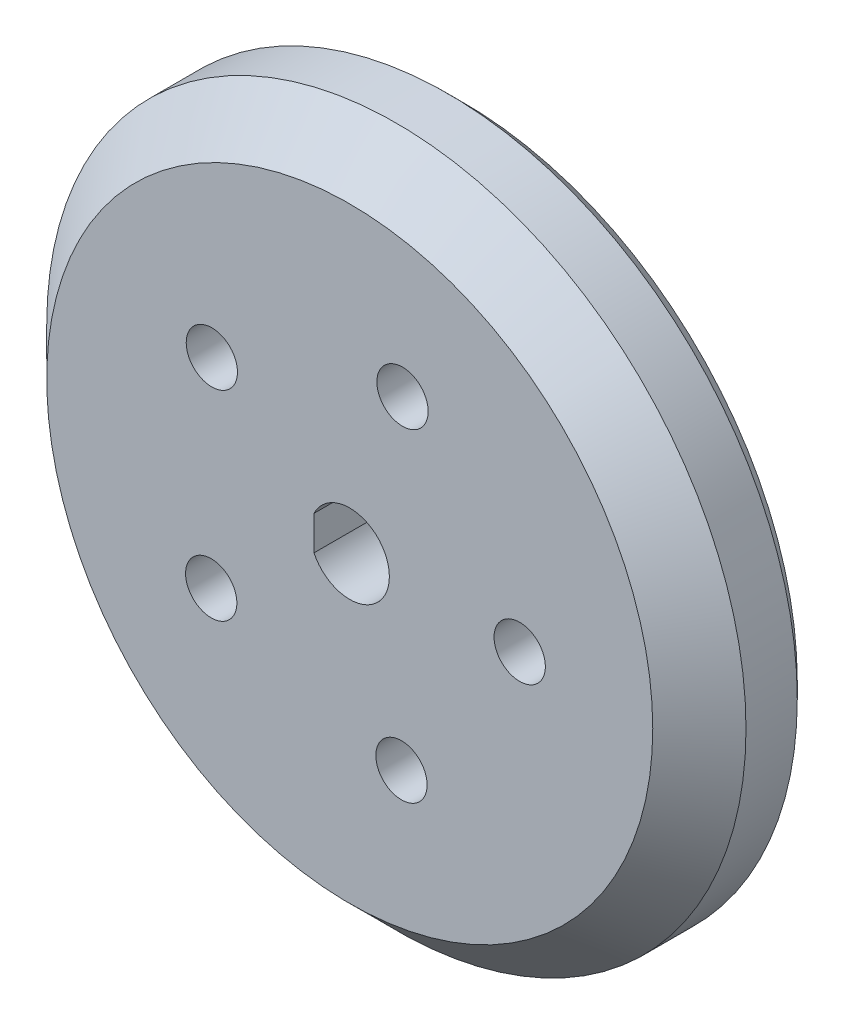
ISO-10303-21;
HEADER;
FILE_DESCRIPTION(('STEP AP214'),'2;1');
FILE_NAME('part.step','',(''),(''),'','','');
FILE_SCHEMA(('AUTOMOTIVE_DESIGN { 1 0 10303 214 1 1 1 1 }'));
ENDSEC;
DATA;
#1=APPLICATION_CONTEXT('core data for automotive mechanical design processes');
#2=APPLICATION_PROTOCOL_DEFINITION('international standard','automotive_design',2000,#1);
#3=PRODUCT_CONTEXT('',#1,'mechanical');
#4=PRODUCT('Part','Part','',(#3));
#5=PRODUCT_RELATED_PRODUCT_CATEGORY('part','',(#4));
#6=PRODUCT_DEFINITION_FORMATION('','',#4);
#7=PRODUCT_DEFINITION_CONTEXT('part definition',#1,'design');
#8=PRODUCT_DEFINITION('design','',#6,#7);
#9=PRODUCT_DEFINITION_SHAPE('','',#8);
#10=(LENGTH_UNIT() NAMED_UNIT(*) SI_UNIT(.MILLI.,.METRE.));
#11=(NAMED_UNIT(*) PLANE_ANGLE_UNIT() SI_UNIT($,.RADIAN.));
#12=(NAMED_UNIT(*) SI_UNIT($,.STERADIAN.) SOLID_ANGLE_UNIT());
#13=UNCERTAINTY_MEASURE_WITH_UNIT(LENGTH_MEASURE(1.E-05),#10,'distance_accuracy_value','');
#14=(GEOMETRIC_REPRESENTATION_CONTEXT(3) GLOBAL_UNCERTAINTY_ASSIGNED_CONTEXT((#13)) GLOBAL_UNIT_ASSIGNED_CONTEXT((#10,
#11,#12)) REPRESENTATION_CONTEXT('',''));
#15=CARTESIAN_POINT('',(0.,0.,0.));
#16=DIRECTION('',(0.,0.,1.));
#17=DIRECTION('',(1.,0.,0.));
#18=AXIS2_PLACEMENT_3D('',#15,#16,#17);
#19=CARTESIAN_POINT('',(0.,0.,7.3));
#20=DIRECTION('',(0.,0.,-1.));
#21=DIRECTION('',(-1.,0.,0.));
#22=AXIS2_PLACEMENT_3D('',#19,#20,#21);
#23=CYLINDRICAL_SURFACE('',#22,2.55);
#24=DIRECTION('',(0.,0.,1.));
#25=VECTOR('',#24,1.);
#26=CARTESIAN_POINT('',(-2.3,-1.10113577727726,-0.216416025930151));
#27=LINE('',#26,#25);
#28=CARTESIAN_POINT('',(-2.3,-1.10113577727726,2.));
#29=VERTEX_POINT('',#28);
#30=CARTESIAN_POINT('',(-2.3,-1.10113577727726,7.3));
#31=VERTEX_POINT('',#30);
#32=EDGE_CURVE('E55',#29,#31,#27,.T.);
#33=ORIENTED_EDGE('',*,*,#32,.T.);
#34=CARTESIAN_POINT('',(0.,0.,7.3));
#35=DIRECTION('',(0.,0.,1.));
#36=DIRECTION('',(1.,0.,0.));
#37=AXIS2_PLACEMENT_3D('',#34,#35,#36);
#38=CIRCLE('',#37,2.55);
#39=CARTESIAN_POINT('',(-2.3,1.10113577727726,7.3));
#40=VERTEX_POINT('',#39);
#41=EDGE_CURVE('E59',#31,#40,#38,.T.);
#42=ORIENTED_EDGE('',*,*,#41,.T.);
#43=DIRECTION('',(0.,0.,1.));
#44=VECTOR('',#43,1.);
#45=CARTESIAN_POINT('',(-2.3,1.10113577727726,-0.216416025930151));
#46=LINE('',#45,#44);
#47=CARTESIAN_POINT('',(-2.3,1.10113577727726,2.));
#48=VERTEX_POINT('',#47);
#49=EDGE_CURVE('E85',#48,#40,#46,.T.);
#50=ORIENTED_EDGE('',*,*,#49,.F.);
#51=CARTESIAN_POINT('',(0.,0.,2.));
#52=DIRECTION('',(0.,0.,-1.));
#53=DIRECTION('',(-1.,0.,0.));
#54=AXIS2_PLACEMENT_3D('',#51,#52,#53);
#55=CIRCLE('',#54,2.55);
#56=EDGE_CURVE('E43',#48,#29,#55,.T.);
#57=ORIENTED_EDGE('',*,*,#56,.T.);
#58=EDGE_LOOP('',(#33,#42,#50,#57));
#59=FACE_BOUND('',#58,.T.);
#60=ADVANCED_FACE('F39',(#59),#23,.F.);
#61=CARTESIAN_POINT('',(0.,0.,7.3));
#62=DIRECTION('',(0.,0.,1.));
#63=DIRECTION('',(1.,0.,0.));
#64=AXIS2_PLACEMENT_3D('',#61,#62,#63);
#65=PLANE('',#64);
#66=CARTESIAN_POINT('',(0.,0.,7.3));
#67=DIRECTION('',(0.,0.,1.));
#68=DIRECTION('',(1.,0.,0.));
#69=AXIS2_PLACEMENT_3D('',#66,#67,#68);
#70=CIRCLE('',#69,19.5);
#71=CARTESIAN_POINT('',(19.5,0.,7.3));
#72=VERTEX_POINT('',#71);
#73=EDGE_CURVE('E48',#72,#72,#70,.T.);
#74=ORIENTED_EDGE('',*,*,#73,.T.);
#75=EDGE_LOOP('',(#74));
#76=FACE_BOUND('',#75,.T.);
#77=CARTESIAN_POINT('',(3.32987337597584,-10.4021806469781,7.3));
#78=DIRECTION('',(0.,0.,-1.));
#79=DIRECTION('',(-1.,0.,0.));
#80=AXIS2_PLACEMENT_3D('',#77,#78,#79);
#81=CIRCLE('',#80,1.65);
#82=CARTESIAN_POINT('',(1.67987337597584,-10.4021806469781,7.3));
#83=VERTEX_POINT('',#82);
#84=EDGE_CURVE('E83',#83,#83,#81,.T.);
#85=ORIENTED_EDGE('',*,*,#84,.T.);
#86=EDGE_LOOP('',(#85));
#87=FACE_BOUND('',#86,.T.);
#88=CARTESIAN_POINT('',(-8.91407422569483,-6.38134837113389,7.3));
#89=DIRECTION('',(0.,0.,-1.));
#90=DIRECTION('',(-1.,0.,0.));
#91=AXIS2_PLACEMENT_3D('',#88,#89,#90);
#92=CIRCLE('',#91,1.65);
#93=CARTESIAN_POINT('',(-10.5640742256948,-6.38134837113389,7.3));
#94=VERTEX_POINT('',#93);
#95=EDGE_CURVE('E121',#94,#94,#92,.T.);
#96=ORIENTED_EDGE('',*,*,#95,.T.);
#97=EDGE_LOOP('',(#96));
#98=FACE_BOUND('',#97,.T.);
#99=CARTESIAN_POINT('',(-8.8736233759759,6.50584328537859,7.3));
#100=DIRECTION('',(0.,0.,-1.));
#101=DIRECTION('',(-1.,0.,0.));
#102=AXIS2_PLACEMENT_3D('',#99,#100,#101);
#103=CIRCLE('',#102,1.65);
#104=CARTESIAN_POINT('',(-10.5236233759759,6.50584328537859,7.3));
#105=VERTEX_POINT('',#104);
#106=EDGE_CURVE('E118',#105,#105,#103,.T.);
#107=ORIENTED_EDGE('',*,*,#106,.T.);
#108=EDGE_LOOP('',(#107));
#109=FACE_BOUND('',#108,.T.);
#110=CARTESIAN_POINT('',(3.39532422569488,10.4497334727931,7.3));
#111=DIRECTION('',(0.,0.,-1.));
#112=DIRECTION('',(-1.,0.,0.));
#113=AXIS2_PLACEMENT_3D('',#110,#111,#112);
#114=CIRCLE('',#113,1.65);
#115=CARTESIAN_POINT('',(1.74532422569488,10.4497334727931,7.3));
#116=VERTEX_POINT('',#115);
#117=EDGE_CURVE('E115',#116,#116,#114,.T.);
#118=ORIENTED_EDGE('',*,*,#117,.T.);
#119=EDGE_LOOP('',(#118));
#120=FACE_BOUND('',#119,.T.);
#121=CARTESIAN_POINT('',(10.9375,0.,7.3));
#122=DIRECTION('',(0.,0.,-1.));
#123=DIRECTION('',(-1.,0.,0.));
#124=AXIS2_PLACEMENT_3D('',#121,#122,#123);
#125=CIRCLE('',#124,1.65);
#126=CARTESIAN_POINT('',(9.2875,0.,7.3));
#127=VERTEX_POINT('',#126);
#128=EDGE_CURVE('E111',#127,#127,#125,.T.);
#129=ORIENTED_EDGE('',*,*,#128,.T.);
#130=EDGE_LOOP('',(#129));
#131=FACE_BOUND('',#130,.T.);
#132=ORIENTED_EDGE('',*,*,#41,.F.);
#133=DIRECTION('',(0.,1.,0.));
#134=VECTOR('',#133,1.);
#135=CARTESIAN_POINT('',(-2.3,-1.10113577727726,7.3));
#136=LINE('',#135,#134);
#137=EDGE_CURVE('E91',#31,#40,#136,.T.);
#138=ORIENTED_EDGE('',*,*,#137,.T.);
#139=EDGE_LOOP('',(#132,#138));
#140=FACE_BOUND('',#139,.T.);
#141=ADVANCED_FACE('F180',(#76,#87,#98,#109,#120,#131,#140),#65,.T.);
#142=CARTESIAN_POINT('',(0.,0.,0.));
#143=DIRECTION('',(0.,0.,1.));
#144=DIRECTION('',(1.,0.,0.));
#145=AXIS2_PLACEMENT_3D('',#142,#143,#144);
#146=PLANE('',#145);
#147=DIRECTION('',(0.,-1.,0.));
#148=VECTOR('',#147,1.);
#149=CARTESIAN_POINT('',(5.65,-6.54980915752513,0.));
#150=LINE('',#149,#148);
#151=CARTESIAN_POINT('',(5.65,6.54980915752513,0.));
#152=VERTEX_POINT('',#151);
#153=CARTESIAN_POINT('',(5.65,-6.54980915752513,0.));
#154=VERTEX_POINT('',#153);
#155=EDGE_CURVE('E101',#152,#154,#150,.T.);
#156=ORIENTED_EDGE('',*,*,#155,.F.);
#157=CARTESIAN_POINT('',(0.,0.,0.));
#158=DIRECTION('',(0.,0.,-1.));
#159=DIRECTION('',(-1.,0.,0.));
#160=AXIS2_PLACEMENT_3D('',#157,#158,#159);
#161=CIRCLE('',#160,8.65);
#162=EDGE_CURVE('E96',#154,#152,#161,.T.);
#163=ORIENTED_EDGE('',*,*,#162,.F.);
#164=EDGE_LOOP('',(#156,#163));
#165=FACE_BOUND('',#164,.T.);
#166=CARTESIAN_POINT('',(0.,0.,0.));
#167=DIRECTION('',(0.,0.,1.));
#168=DIRECTION('',(1.,0.,0.));
#169=AXIS2_PLACEMENT_3D('',#166,#167,#168);
#170=CIRCLE('',#169,21.5);
#171=CARTESIAN_POINT('',(21.5,0.,0.));
#172=VERTEX_POINT('',#171);
#173=EDGE_CURVE('E174',#172,#172,#170,.F.);
#174=ORIENTED_EDGE('',*,*,#173,.T.);
#175=EDGE_LOOP('',(#174));
#176=FACE_BOUND('',#175,.T.);
#177=CARTESIAN_POINT('',(3.32987337597584,-10.4021806469781,0.));
#178=DIRECTION('',(0.,0.,1.));
#179=DIRECTION('',(1.,0.,0.));
#180=AXIS2_PLACEMENT_3D('',#177,#178,#179);
#181=CIRCLE('',#180,1.65);
#182=CARTESIAN_POINT('',(4.97987337597584,-10.4021806469781,0.));
#183=VERTEX_POINT('',#182);
#184=EDGE_CURVE('E156',#183,#183,#181,.T.);
#185=ORIENTED_EDGE('',*,*,#184,.T.);
#186=EDGE_LOOP('',(#185));
#187=FACE_BOUND('',#186,.T.);
#188=CARTESIAN_POINT('',(-8.91407422569483,-6.38134837113389,0.));
#189=DIRECTION('',(0.,0.,1.));
#190=DIRECTION('',(1.,0.,0.));
#191=AXIS2_PLACEMENT_3D('',#188,#189,#190);
#192=CIRCLE('',#191,1.65);
#193=CARTESIAN_POINT('',(-7.26407422569483,-6.38134837113389,0.));
#194=VERTEX_POINT('',#193);
#195=EDGE_CURVE('E167',#194,#194,#192,.T.);
#196=ORIENTED_EDGE('',*,*,#195,.T.);
#197=EDGE_LOOP('',(#196));
#198=FACE_BOUND('',#197,.T.);
#199=CARTESIAN_POINT('',(-8.8736233759759,6.50584328537859,0.));
#200=DIRECTION('',(0.,0.,1.));
#201=DIRECTION('',(1.,0.,0.));
#202=AXIS2_PLACEMENT_3D('',#199,#200,#201);
#203=CIRCLE('',#202,1.65);
#204=CARTESIAN_POINT('',(-7.2236233759759,6.50584328537859,0.));
#205=VERTEX_POINT('',#204);
#206=EDGE_CURVE('E164',#205,#205,#203,.T.);
#207=ORIENTED_EDGE('',*,*,#206,.T.);
#208=EDGE_LOOP('',(#207));
#209=FACE_BOUND('',#208,.T.);
#210=CARTESIAN_POINT('',(3.39532422569488,10.4497334727931,0.));
#211=DIRECTION('',(0.,0.,1.));
#212=DIRECTION('',(1.,0.,0.));
#213=AXIS2_PLACEMENT_3D('',#210,#211,#212);
#214=CIRCLE('',#213,1.65);
#215=CARTESIAN_POINT('',(5.04532422569488,10.4497334727931,0.));
#216=VERTEX_POINT('',#215);
#217=EDGE_CURVE('E161',#216,#216,#214,.T.);
#218=ORIENTED_EDGE('',*,*,#217,.T.);
#219=EDGE_LOOP('',(#218));
#220=FACE_BOUND('',#219,.T.);
#221=CARTESIAN_POINT('',(10.9375,0.,0.));
#222=DIRECTION('',(0.,0.,1.));
#223=DIRECTION('',(1.,0.,0.));
#224=AXIS2_PLACEMENT_3D('',#221,#222,#223);
#225=CIRCLE('',#224,1.65);
#226=CARTESIAN_POINT('',(12.5875,0.,0.));
#227=VERTEX_POINT('',#226);
#228=EDGE_CURVE('E114',#227,#227,#225,.T.);
#229=ORIENTED_EDGE('',*,*,#228,.T.);
#230=EDGE_LOOP('',(#229));
#231=FACE_BOUND('',#230,.T.);
#232=CARTESIAN_POINT('',(18.85,0.,0.));
#233=DIRECTION('',(0.,0.,-1.));
#234=DIRECTION('',(-1.,0.,0.));
#235=AXIS2_PLACEMENT_3D('',#232,#233,#234);
#236=CIRCLE('',#235,1.525);
#237=CARTESIAN_POINT('',(17.325,0.,0.));
#238=VERTEX_POINT('',#237);
#239=EDGE_CURVE('E129',#238,#238,#236,.T.);
#240=ORIENTED_EDGE('',*,*,#239,.F.);
#241=EDGE_LOOP('',(#240));
#242=FACE_BOUND('',#241,.T.);
#243=CARTESIAN_POINT('',(5.82497034396776,17.9274153321637,0.));
#244=DIRECTION('',(0.,0.,-1.));
#245=DIRECTION('',(-1.,0.,0.));
#246=AXIS2_PLACEMENT_3D('',#243,#244,#245);
#247=CIRCLE('',#246,1.525);
#248=CARTESIAN_POINT('',(4.29997034396776,17.9274153321637,0.));
#249=VERTEX_POINT('',#248);
#250=EDGE_CURVE('E135',#249,#249,#247,.T.);
#251=ORIENTED_EDGE('',*,*,#250,.F.);
#252=EDGE_LOOP('',(#251));
#253=FACE_BOUND('',#252,.T.);
#254=CARTESIAN_POINT('',(-15.2499703439678,11.0797520057131,0.));
#255=DIRECTION('',(0.,0.,-1.));
#256=DIRECTION('',(-1.,0.,0.));
#257=AXIS2_PLACEMENT_3D('',#254,#255,#256);
#258=CIRCLE('',#257,1.525);
#259=CARTESIAN_POINT('',(-16.7749703439678,11.0797520057131,0.));
#260=VERTEX_POINT('',#259);
#261=EDGE_CURVE('E141',#260,#260,#258,.T.);
#262=ORIENTED_EDGE('',*,*,#261,.F.);
#263=EDGE_LOOP('',(#262));
#264=FACE_BOUND('',#263,.T.);
#265=CARTESIAN_POINT('',(-15.2499703439678,-11.0797520057131,0.));
#266=DIRECTION('',(0.,0.,-1.));
#267=DIRECTION('',(-1.,0.,0.));
#268=AXIS2_PLACEMENT_3D('',#265,#266,#267);
#269=CIRCLE('',#268,1.525);
#270=CARTESIAN_POINT('',(-16.7749703439678,-11.0797520057131,0.));
#271=VERTEX_POINT('',#270);
#272=EDGE_CURVE('E147',#271,#271,#269,.T.);
#273=ORIENTED_EDGE('',*,*,#272,.F.);
#274=EDGE_LOOP('',(#273));
#275=FACE_BOUND('',#274,.T.);
#276=CARTESIAN_POINT('',(5.82497034396775,-17.9274153321637,0.));
#277=DIRECTION('',(0.,0.,-1.));
#278=DIRECTION('',(-1.,0.,0.));
#279=AXIS2_PLACEMENT_3D('',#276,#277,#278);
#280=CIRCLE('',#279,1.525);
#281=CARTESIAN_POINT('',(4.29997034396775,-17.9274153321637,0.));
#282=VERTEX_POINT('',#281);
#283=EDGE_CURVE('E153',#282,#282,#280,.T.);
#284=ORIENTED_EDGE('',*,*,#283,.F.);
#285=EDGE_LOOP('',(#284));
#286=FACE_BOUND('',#285,.T.);
#287=ADVANCED_FACE('F202',(#165,#176,#187,#198,#209,#220,#231,#242,#253,#264,#275,#286),#146,.F.);
#288=CARTESIAN_POINT('',(0.,0.,7.3));
#289=DIRECTION('',(0.,0.,-1.));
#290=DIRECTION('',(-1.,0.,0.));
#291=AXIS2_PLACEMENT_3D('',#288,#289,#290);
#292=CYLINDRICAL_SURFACE('',#291,22.5);
#293=CARTESIAN_POINT('',(0.,0.,4.3));
#294=DIRECTION('',(0.,0.,1.));
#295=DIRECTION('',(1.,0.,0.));
#296=AXIS2_PLACEMENT_3D('',#293,#294,#295);
#297=CIRCLE('',#296,22.5);
#298=CARTESIAN_POINT('',(22.5,0.,4.3));
#299=VERTEX_POINT('',#298);
#300=EDGE_CURVE('E11',#299,#299,#297,.F.);
#301=ORIENTED_EDGE('',*,*,#300,.T.);
#302=EDGE_LOOP('',(#301));
#303=FACE_BOUND('',#302,.T.);
#304=CARTESIAN_POINT('',(0.,0.,1.00000000000001));
#305=DIRECTION('',(0.,0.,1.));
#306=DIRECTION('',(1.,0.,0.));
#307=AXIS2_PLACEMENT_3D('',#304,#305,#306);
#308=CIRCLE('',#307,22.5);
#309=CARTESIAN_POINT('',(22.5,0.,1.00000000000001));
#310=VERTEX_POINT('',#309);
#311=EDGE_CURVE('E158',#310,#310,#308,.T.);
#312=ORIENTED_EDGE('',*,*,#311,.T.);
#313=EDGE_LOOP('',(#312));
#314=FACE_BOUND('',#313,.T.);
#315=ADVANCED_FACE('F210',(#303,#314),#292,.T.);
#316=CARTESIAN_POINT('',(5.82497034396775,-17.9274153321637,3.4));
#317=DIRECTION('',(0.,0.,-1.));
#318=DIRECTION('',(-1.,0.,0.));
#319=AXIS2_PLACEMENT_3D('',#316,#317,#318);
#320=CYLINDRICAL_SURFACE('',#319,1.525);
#321=CARTESIAN_POINT('',(5.82497034396775,-17.9274153321637,3.4));
#322=DIRECTION('',(0.,0.,-1.));
#323=DIRECTION('',(-1.,0.,0.));
#324=AXIS2_PLACEMENT_3D('',#321,#322,#323);
#325=CIRCLE('',#324,1.525);
#326=CARTESIAN_POINT('',(4.29997034396775,-17.9274153321637,3.4));
#327=VERTEX_POINT('',#326);
#328=EDGE_CURVE('E150',#327,#327,#325,.T.);
#329=ORIENTED_EDGE('',*,*,#328,.F.);
#330=EDGE_LOOP('',(#329));
#331=FACE_BOUND('',#330,.T.);
#332=ORIENTED_EDGE('',*,*,#283,.T.);
#333=EDGE_LOOP('',(#332));
#334=FACE_BOUND('',#333,.T.);
#335=ADVANCED_FACE('F205',(#331,#334),#320,.F.);
#336=CARTESIAN_POINT('',(5.82497034396775,-17.9274153321637,3.4));
#337=DIRECTION('',(0.,0.,-1.));
#338=DIRECTION('',(-1.,0.,0.));
#339=AXIS2_PLACEMENT_3D('',#336,#337,#338);
#340=PLANE('',#339);
#341=ORIENTED_EDGE('',*,*,#328,.T.);
#342=EDGE_LOOP('',(#341));
#343=FACE_BOUND('',#342,.T.);
#344=ADVANCED_FACE('F217',(#343),#340,.T.);
#345=CARTESIAN_POINT('',(-15.2499703439678,-11.0797520057131,3.4));
#346=DIRECTION('',(0.,0.,-1.));
#347=DIRECTION('',(-1.,0.,0.));
#348=AXIS2_PLACEMENT_3D('',#345,#346,#347);
#349=CYLINDRICAL_SURFACE('',#348,1.525);
#350=CARTESIAN_POINT('',(-15.2499703439678,-11.0797520057131,3.4));
#351=DIRECTION('',(0.,0.,-1.));
#352=DIRECTION('',(-1.,0.,0.));
#353=AXIS2_PLACEMENT_3D('',#350,#351,#352);
#354=CIRCLE('',#353,1.525);
#355=CARTESIAN_POINT('',(-16.7749703439678,-11.0797520057131,3.4));
#356=VERTEX_POINT('',#355);
#357=EDGE_CURVE('E144',#356,#356,#354,.T.);
#358=ORIENTED_EDGE('',*,*,#357,.F.);
#359=EDGE_LOOP('',(#358));
#360=FACE_BOUND('',#359,.T.);
#361=ORIENTED_EDGE('',*,*,#272,.T.);
#362=EDGE_LOOP('',(#361));
#363=FACE_BOUND('',#362,.T.);
#364=ADVANCED_FACE('F225',(#360,#363),#349,.F.);
#365=CARTESIAN_POINT('',(-15.2499703439678,-11.0797520057131,3.4));
#366=DIRECTION('',(0.,0.,-1.));
#367=DIRECTION('',(-1.,0.,0.));
#368=AXIS2_PLACEMENT_3D('',#365,#366,#367);
#369=PLANE('',#368);
#370=ORIENTED_EDGE('',*,*,#357,.T.);
#371=EDGE_LOOP('',(#370));
#372=FACE_BOUND('',#371,.T.);
#373=ADVANCED_FACE('F234',(#372),#369,.T.);
#374=CARTESIAN_POINT('',(-15.2499703439678,11.0797520057131,3.4));
#375=DIRECTION('',(0.,0.,-1.));
#376=DIRECTION('',(-1.,0.,0.));
#377=AXIS2_PLACEMENT_3D('',#374,#375,#376);
#378=CYLINDRICAL_SURFACE('',#377,1.525);
#379=CARTESIAN_POINT('',(-15.2499703439678,11.0797520057131,3.4));
#380=DIRECTION('',(0.,0.,-1.));
#381=DIRECTION('',(-1.,0.,0.));
#382=AXIS2_PLACEMENT_3D('',#379,#380,#381);
#383=CIRCLE('',#382,1.525);
#384=CARTESIAN_POINT('',(-16.7749703439678,11.0797520057131,3.4));
#385=VERTEX_POINT('',#384);
#386=EDGE_CURVE('E138',#385,#385,#383,.T.);
#387=ORIENTED_EDGE('',*,*,#386,.F.);
#388=EDGE_LOOP('',(#387));
#389=FACE_BOUND('',#388,.T.);
#390=ORIENTED_EDGE('',*,*,#261,.T.);
#391=EDGE_LOOP('',(#390));
#392=FACE_BOUND('',#391,.T.);
#393=ADVANCED_FACE('F240',(#389,#392),#378,.F.);
#394=CARTESIAN_POINT('',(-15.2499703439678,11.0797520057131,3.4));
#395=DIRECTION('',(0.,0.,-1.));
#396=DIRECTION('',(-1.,0.,0.));
#397=AXIS2_PLACEMENT_3D('',#394,#395,#396);
#398=PLANE('',#397);
#399=ORIENTED_EDGE('',*,*,#386,.T.);
#400=EDGE_LOOP('',(#399));
#401=FACE_BOUND('',#400,.T.);
#402=ADVANCED_FACE('F244',(#401),#398,.T.);
#403=CARTESIAN_POINT('',(5.82497034396776,17.9274153321637,3.4));
#404=DIRECTION('',(0.,0.,-1.));
#405=DIRECTION('',(-1.,0.,0.));
#406=AXIS2_PLACEMENT_3D('',#403,#404,#405);
#407=CYLINDRICAL_SURFACE('',#406,1.525);
#408=CARTESIAN_POINT('',(5.82497034396776,17.9274153321637,3.4));
#409=DIRECTION('',(0.,0.,-1.));
#410=DIRECTION('',(-1.,0.,0.));
#411=AXIS2_PLACEMENT_3D('',#408,#409,#410);
#412=CIRCLE('',#411,1.525);
#413=CARTESIAN_POINT('',(4.29997034396776,17.9274153321637,3.4));
#414=VERTEX_POINT('',#413);
#415=EDGE_CURVE('E132',#414,#414,#412,.T.);
#416=ORIENTED_EDGE('',*,*,#415,.F.);
#417=EDGE_LOOP('',(#416));
#418=FACE_BOUND('',#417,.T.);
#419=ORIENTED_EDGE('',*,*,#250,.T.);
#420=EDGE_LOOP('',(#419));
#421=FACE_BOUND('',#420,.T.);
#422=ADVANCED_FACE('F248',(#418,#421),#407,.F.);
#423=CARTESIAN_POINT('',(5.82497034396776,17.9274153321637,3.4));
#424=DIRECTION('',(0.,0.,-1.));
#425=DIRECTION('',(-1.,0.,0.));
#426=AXIS2_PLACEMENT_3D('',#423,#424,#425);
#427=PLANE('',#426);
#428=ORIENTED_EDGE('',*,*,#415,.T.);
#429=EDGE_LOOP('',(#428));
#430=FACE_BOUND('',#429,.T.);
#431=ADVANCED_FACE('F252',(#430),#427,.T.);
#432=CARTESIAN_POINT('',(18.85,0.,3.4));
#433=DIRECTION('',(0.,0.,-1.));
#434=DIRECTION('',(-1.,0.,0.));
#435=AXIS2_PLACEMENT_3D('',#432,#433,#434);
#436=CYLINDRICAL_SURFACE('',#435,1.525);
#437=CARTESIAN_POINT('',(18.85,0.,3.4));
#438=DIRECTION('',(0.,0.,-1.));
#439=DIRECTION('',(-1.,0.,0.));
#440=AXIS2_PLACEMENT_3D('',#437,#438,#439);
#441=CIRCLE('',#440,1.525);
#442=CARTESIAN_POINT('',(17.325,0.,3.4));
#443=VERTEX_POINT('',#442);
#444=EDGE_CURVE('E126',#443,#443,#441,.T.);
#445=ORIENTED_EDGE('',*,*,#444,.F.);
#446=EDGE_LOOP('',(#445));
#447=FACE_BOUND('',#446,.T.);
#448=ORIENTED_EDGE('',*,*,#239,.T.);
#449=EDGE_LOOP('',(#448));
#450=FACE_BOUND('',#449,.T.);
#451=ADVANCED_FACE('F256',(#447,#450),#436,.F.);
#452=CARTESIAN_POINT('',(18.85,0.,3.4));
#453=DIRECTION('',(0.,0.,-1.));
#454=DIRECTION('',(-1.,0.,0.));
#455=AXIS2_PLACEMENT_3D('',#452,#453,#454);
#456=PLANE('',#455);
#457=ORIENTED_EDGE('',*,*,#444,.T.);
#458=EDGE_LOOP('',(#457));
#459=FACE_BOUND('',#458,.T.);
#460=ADVANCED_FACE('F260',(#459),#456,.T.);
#461=CARTESIAN_POINT('',(10.9375,0.,7.3));
#462=DIRECTION('',(0.,0.,-1.));
#463=DIRECTION('',(-1.,0.,0.));
#464=AXIS2_PLACEMENT_3D('',#461,#462,#463);
#465=CYLINDRICAL_SURFACE('',#464,1.65);
#466=ORIENTED_EDGE('',*,*,#128,.F.);
#467=EDGE_LOOP('',(#466));
#468=FACE_BOUND('',#467,.T.);
#469=ORIENTED_EDGE('',*,*,#228,.F.);
#470=EDGE_LOOP('',(#469));
#471=FACE_BOUND('',#470,.T.);
#472=ADVANCED_FACE('F264',(#468,#471),#465,.F.);
#473=CARTESIAN_POINT('',(3.39532422569488,10.4497334727931,7.3));
#474=DIRECTION('',(0.,0.,-1.));
#475=DIRECTION('',(-1.,0.,0.));
#476=AXIS2_PLACEMENT_3D('',#473,#474,#475);
#477=CYLINDRICAL_SURFACE('',#476,1.65);
#478=ORIENTED_EDGE('',*,*,#117,.F.);
#479=EDGE_LOOP('',(#478));
#480=FACE_BOUND('',#479,.T.);
#481=ORIENTED_EDGE('',*,*,#217,.F.);
#482=EDGE_LOOP('',(#481));
#483=FACE_BOUND('',#482,.T.);
#484=ADVANCED_FACE('F276',(#480,#483),#477,.F.);
#485=CARTESIAN_POINT('',(-8.8736233759759,6.50584328537859,7.3));
#486=DIRECTION('',(0.,0.,-1.));
#487=DIRECTION('',(-1.,0.,0.));
#488=AXIS2_PLACEMENT_3D('',#485,#486,#487);
#489=CYLINDRICAL_SURFACE('',#488,1.65);
#490=ORIENTED_EDGE('',*,*,#106,.F.);
#491=EDGE_LOOP('',(#490));
#492=FACE_BOUND('',#491,.T.);
#493=ORIENTED_EDGE('',*,*,#206,.F.);
#494=EDGE_LOOP('',(#493));
#495=FACE_BOUND('',#494,.T.);
#496=ADVANCED_FACE('F272',(#492,#495),#489,.F.);
#497=CARTESIAN_POINT('',(-8.91407422569483,-6.38134837113389,7.3));
#498=DIRECTION('',(0.,0.,-1.));
#499=DIRECTION('',(-1.,0.,0.));
#500=AXIS2_PLACEMENT_3D('',#497,#498,#499);
#501=CYLINDRICAL_SURFACE('',#500,1.65);
#502=ORIENTED_EDGE('',*,*,#95,.F.);
#503=EDGE_LOOP('',(#502));
#504=FACE_BOUND('',#503,.T.);
#505=ORIENTED_EDGE('',*,*,#195,.F.);
#506=EDGE_LOOP('',(#505));
#507=FACE_BOUND('',#506,.T.);
#508=ADVANCED_FACE('F268',(#504,#507),#501,.F.);
#509=CARTESIAN_POINT('',(3.32987337597584,-10.4021806469781,7.3));
#510=DIRECTION('',(0.,0.,-1.));
#511=DIRECTION('',(-1.,0.,0.));
#512=AXIS2_PLACEMENT_3D('',#509,#510,#511);
#513=CYLINDRICAL_SURFACE('',#512,1.65);
#514=ORIENTED_EDGE('',*,*,#84,.F.);
#515=EDGE_LOOP('',(#514));
#516=FACE_BOUND('',#515,.T.);
#517=ORIENTED_EDGE('',*,*,#184,.F.);
#518=EDGE_LOOP('',(#517));
#519=FACE_BOUND('',#518,.T.);
#520=ADVANCED_FACE('F194',(#516,#519),#513,.F.);
#521=CARTESIAN_POINT('',(0.,0.,1.00000000000001));
#522=DIRECTION('',(0.,0.,1.));
#523=DIRECTION('',(1.,0.,0.));
#524=AXIS2_PLACEMENT_3D('',#521,#522,#523);
#525=CONICAL_SURFACE('',#524,22.5,0.785398163397453);
#526=ORIENTED_EDGE('',*,*,#173,.F.);
#527=EDGE_LOOP('',(#526));
#528=FACE_BOUND('',#527,.T.);
#529=ORIENTED_EDGE('',*,*,#311,.F.);
#530=EDGE_LOOP('',(#529));
#531=FACE_BOUND('',#530,.T.);
#532=ADVANCED_FACE('F185',(#528,#531),#525,.T.);
#533=CARTESIAN_POINT('',(0.,0.,7.3));
#534=DIRECTION('',(0.,0.,-1.));
#535=DIRECTION('',(-1.,0.,0.));
#536=AXIS2_PLACEMENT_3D('',#533,#534,#535);
#537=CONICAL_SURFACE('',#536,19.5,0.785398163397448);
#538=ORIENTED_EDGE('',*,*,#300,.F.);
#539=EDGE_LOOP('',(#538));
#540=FACE_BOUND('',#539,.T.);
#541=ORIENTED_EDGE('',*,*,#73,.F.);
#542=EDGE_LOOP('',(#541));
#543=FACE_BOUND('',#542,.T.);
#544=ADVANCED_FACE('F41',(#540,#543),#537,.T.);
#545=CARTESIAN_POINT('',(0.,0.,2.));
#546=DIRECTION('',(0.,0.,-1.));
#547=DIRECTION('',(-1.,0.,0.));
#548=AXIS2_PLACEMENT_3D('',#545,#546,#547);
#549=CYLINDRICAL_SURFACE('',#548,8.65);
#550=ORIENTED_EDGE('',*,*,#162,.T.);
#551=DIRECTION('',(0.,0.,-1.));
#552=VECTOR('',#551,1.);
#553=CARTESIAN_POINT('',(5.65,6.54980915752513,2.));
#554=LINE('',#553,#552);
#555=CARTESIAN_POINT('',(5.65,6.54980915752513,2.));
#556=VERTEX_POINT('',#555);
#557=EDGE_CURVE('E104',#556,#152,#554,.T.);
#558=ORIENTED_EDGE('',*,*,#557,.F.);
#559=CARTESIAN_POINT('',(0.,0.,2.));
#560=DIRECTION('',(0.,0.,-1.));
#561=DIRECTION('',(-1.,0.,0.));
#562=AXIS2_PLACEMENT_3D('',#559,#560,#561);
#563=CIRCLE('',#562,8.65);
#564=CARTESIAN_POINT('',(5.65,-6.54980915752513,2.));
#565=VERTEX_POINT('',#564);
#566=EDGE_CURVE('E97',#565,#556,#563,.T.);
#567=ORIENTED_EDGE('',*,*,#566,.F.);
#568=DIRECTION('',(0.,0.,-1.));
#569=VECTOR('',#568,1.);
#570=CARTESIAN_POINT('',(5.65,-6.54980915752513,2.));
#571=LINE('',#570,#569);
#572=EDGE_CURVE('E84',#565,#154,#571,.T.);
#573=ORIENTED_EDGE('',*,*,#572,.T.);
#574=EDGE_LOOP('',(#550,#558,#567,#573));
#575=FACE_BOUND('',#574,.T.);
#576=ADVANCED_FACE('F184',(#575),#549,.F.);
#577=CARTESIAN_POINT('',(5.65,-6.54980915752513,2.));
#578=DIRECTION('',(1.,0.,0.));
#579=DIRECTION('',(0.,0.,-1.));
#580=AXIS2_PLACEMENT_3D('',#577,#578,#579);
#581=PLANE('',#580);
#582=ORIENTED_EDGE('',*,*,#155,.T.);
#583=ORIENTED_EDGE('',*,*,#572,.F.);
#584=DIRECTION('',(0.,-1.,0.));
#585=VECTOR('',#584,1.);
#586=CARTESIAN_POINT('',(5.65,-6.54980915752513,2.));
#587=LINE('',#586,#585);
#588=EDGE_CURVE('E100',#556,#565,#587,.T.);
#589=ORIENTED_EDGE('',*,*,#588,.F.);
#590=ORIENTED_EDGE('',*,*,#557,.T.);
#591=EDGE_LOOP('',(#582,#583,#589,#590));
#592=FACE_BOUND('',#591,.T.);
#593=ADVANCED_FACE('F191',(#592),#581,.F.);
#594=CARTESIAN_POINT('',(0.,0.,2.));
#595=DIRECTION('',(0.,0.,-1.));
#596=DIRECTION('',(-1.,0.,0.));
#597=AXIS2_PLACEMENT_3D('',#594,#595,#596);
#598=PLANE('',#597);
#599=ORIENTED_EDGE('',*,*,#56,.F.);
#600=DIRECTION('',(0.,1.,0.));
#601=VECTOR('',#600,1.);
#602=CARTESIAN_POINT('',(-2.3,-1.10113577727726,2.));
#603=LINE('',#602,#601);
#604=EDGE_CURVE('E82',#29,#48,#603,.T.);
#605=ORIENTED_EDGE('',*,*,#604,.F.);
#606=EDGE_LOOP('',(#599,#605));
#607=FACE_BOUND('',#606,.T.);
#608=ORIENTED_EDGE('',*,*,#566,.T.);
#609=ORIENTED_EDGE('',*,*,#588,.T.);
#610=EDGE_LOOP('',(#608,#609));
#611=FACE_BOUND('',#610,.T.);
#612=ADVANCED_FACE('F79',(#607,#611),#598,.T.);
#613=CARTESIAN_POINT('',(-2.3,-1.10113577727726,-0.216416025930151));
#614=DIRECTION('',(1.,0.,0.));
#615=DIRECTION('',(0.,0.,-1.));
#616=AXIS2_PLACEMENT_3D('',#613,#614,#615);
#617=PLANE('',#616);
#618=ORIENTED_EDGE('',*,*,#32,.F.);
#619=ORIENTED_EDGE('',*,*,#604,.T.);
#620=ORIENTED_EDGE('',*,*,#49,.T.);
#621=ORIENTED_EDGE('',*,*,#137,.F.);
#622=EDGE_LOOP('',(#618,#619,#620,#621));
#623=FACE_BOUND('',#622,.T.);
#624=ADVANCED_FACE('F90',(#623),#617,.T.);
#625=CLOSED_SHELL('',(#60,#141,#287,#315,#335,#344,#364,#373,#393,#402,#422,#431,#451,#460,#472,
#484,#496,#508,#520,#532,#544,#576,#593,#612,#624));
#626=MANIFOLD_SOLID_BREP('B2',#625);
#627=ADVANCED_BREP_SHAPE_REPRESENTATION('',(#18,#626),#14);
#628=SHAPE_DEFINITION_REPRESENTATION(#9,#627);
ENDSEC;
END-ISO-10303-21;
